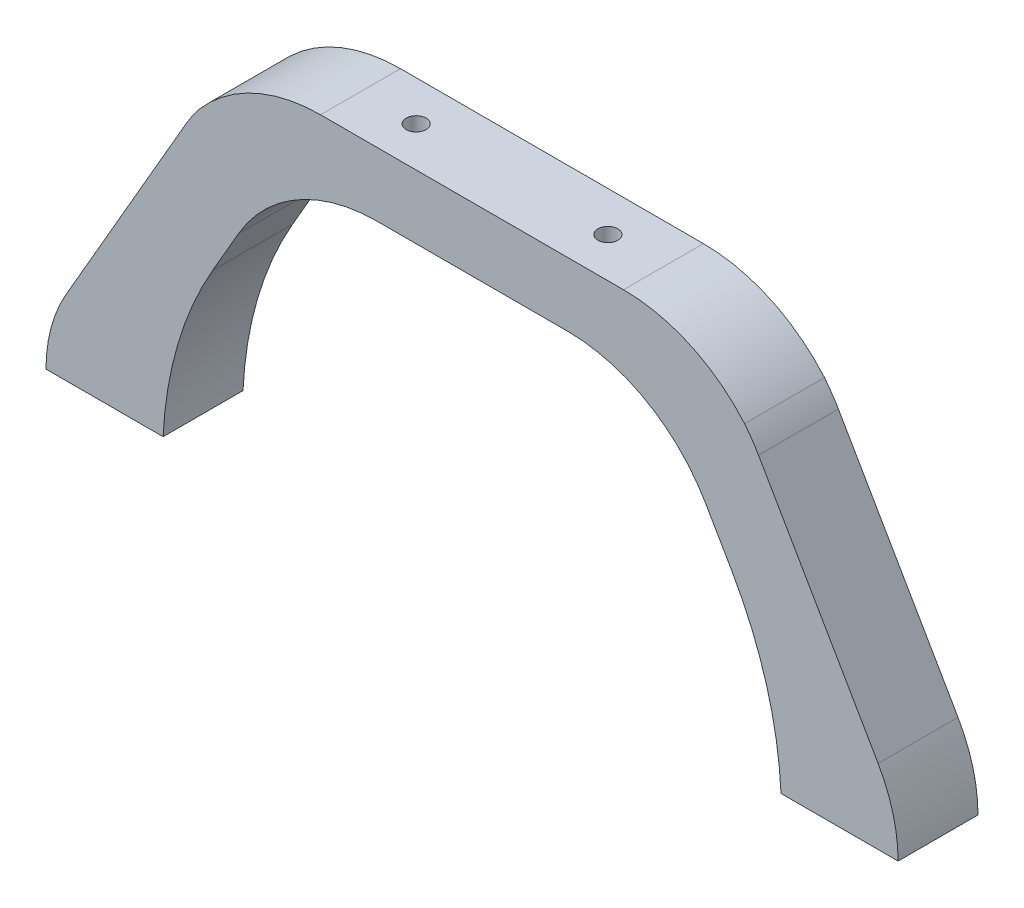
ISO-10303-21;
HEADER;
FILE_DESCRIPTION(('STEP AP214'),'2;1');
FILE_NAME('part.step','',(''),(''),'','','');
FILE_SCHEMA(('AUTOMOTIVE_DESIGN { 1 0 10303 214 1 1 1 1 }'));
ENDSEC;
DATA;
#1=APPLICATION_CONTEXT('core data for automotive mechanical design processes');
#2=APPLICATION_PROTOCOL_DEFINITION('international standard','automotive_design',2000,#1);
#3=PRODUCT_CONTEXT('',#1,'mechanical');
#4=PRODUCT('Part','Part','',(#3));
#5=PRODUCT_RELATED_PRODUCT_CATEGORY('part','',(#4));
#6=PRODUCT_DEFINITION_FORMATION('','',#4);
#7=PRODUCT_DEFINITION_CONTEXT('part definition',#1,'design');
#8=PRODUCT_DEFINITION('design','',#6,#7);
#9=PRODUCT_DEFINITION_SHAPE('','',#8);
#10=(LENGTH_UNIT() NAMED_UNIT(*) SI_UNIT(.MILLI.,.METRE.));
#11=(NAMED_UNIT(*) PLANE_ANGLE_UNIT() SI_UNIT($,.RADIAN.));
#12=(NAMED_UNIT(*) SI_UNIT($,.STERADIAN.) SOLID_ANGLE_UNIT());
#13=UNCERTAINTY_MEASURE_WITH_UNIT(LENGTH_MEASURE(1.E-05),#10,'distance_accuracy_value','');
#14=(GEOMETRIC_REPRESENTATION_CONTEXT(3) GLOBAL_UNCERTAINTY_ASSIGNED_CONTEXT((#13)) GLOBAL_UNIT_ASSIGNED_CONTEXT((#10,
#11,#12)) REPRESENTATION_CONTEXT('',''));
#15=CARTESIAN_POINT('',(0.,0.,0.));
#16=DIRECTION('',(0.,0.,1.));
#17=DIRECTION('',(1.,0.,0.));
#18=AXIS2_PLACEMENT_3D('',#15,#16,#17);
#19=CARTESIAN_POINT('',(18.,49.828096349245,0.));
#20=DIRECTION('',(0.,1.,0.));
#21=DIRECTION('',(0.,0.,1.));
#22=AXIS2_PLACEMENT_3D('',#19,#20,#21);
#23=CYLINDRICAL_SURFACE('',#22,1.875);
#24=CARTESIAN_POINT('',(18.,67.1313972081441,0.));
#25=DIRECTION('',(0.,1.,0.));
#26=DIRECTION('',(0.,0.,1.));
#27=AXIS2_PLACEMENT_3D('',#24,#25,#26);
#28=CIRCLE('',#27,1.875);
#29=CARTESIAN_POINT('',(18.,67.1313972081441,1.875));
#30=VERTEX_POINT('',#29);
#31=EDGE_CURVE('E312',#30,#30,#28,.T.);
#32=ORIENTED_EDGE('',*,*,#31,.T.);
#33=EDGE_LOOP('',(#32));
#34=FACE_BOUND('',#33,.T.);
#35=CARTESIAN_POINT('',(18.,58.1313972081441,0.));
#36=DIRECTION('',(0.,-1.,0.));
#37=DIRECTION('',(0.,0.,-1.));
#38=AXIS2_PLACEMENT_3D('',#35,#36,#37);
#39=CIRCLE('',#38,1.875);
#40=CARTESIAN_POINT('',(18.,58.1313972081441,-1.875));
#41=VERTEX_POINT('',#40);
#42=EDGE_CURVE('E542',#41,#41,#39,.T.);
#43=ORIENTED_EDGE('',*,*,#42,.T.);
#44=EDGE_LOOP('',(#43));
#45=FACE_BOUND('',#44,.T.);
#46=ADVANCED_FACE('F49',(#34,#45),#23,.F.);
#47=CARTESIAN_POINT('',(-18.,49.828096349245,0.));
#48=DIRECTION('',(0.,1.,0.));
#49=DIRECTION('',(0.,0.,1.));
#50=AXIS2_PLACEMENT_3D('',#47,#48,#49);
#51=CYLINDRICAL_SURFACE('',#50,1.875);
#52=CARTESIAN_POINT('',(-18.,67.1313972081441,0.));
#53=DIRECTION('',(0.,1.,0.));
#54=DIRECTION('',(0.,0.,1.));
#55=AXIS2_PLACEMENT_3D('',#52,#53,#54);
#56=CIRCLE('',#55,1.875);
#57=CARTESIAN_POINT('',(-18.,67.1313972081441,1.875));
#58=VERTEX_POINT('',#57);
#59=EDGE_CURVE('E433',#58,#58,#56,.T.);
#60=ORIENTED_EDGE('',*,*,#59,.T.);
#61=EDGE_LOOP('',(#60));
#62=FACE_BOUND('',#61,.T.);
#63=CARTESIAN_POINT('',(-18.,58.1313972081441,0.));
#64=DIRECTION('',(0.,-1.,0.));
#65=DIRECTION('',(0.,0.,-1.));
#66=AXIS2_PLACEMENT_3D('',#63,#64,#65);
#67=CIRCLE('',#66,1.875);
#68=CARTESIAN_POINT('',(-18.,58.1313972081441,-1.875));
#69=VERTEX_POINT('',#68);
#70=EDGE_CURVE('E543',#69,#69,#67,.T.);
#71=ORIENTED_EDGE('',*,*,#70,.T.);
#72=EDGE_LOOP('',(#71));
#73=FACE_BOUND('',#72,.T.);
#74=ADVANCED_FACE('F330',(#62,#73),#51,.F.);
#75=CARTESIAN_POINT('',(0.,0.,7.5));
#76=DIRECTION('',(0.,-1.,0.));
#77=DIRECTION('',(1.,0.,0.));
#78=AXIS2_PLACEMENT_3D('',#75,#76,#77);
#79=PLANE('',#78);
#80=DIRECTION('',(-1.,0.,0.));
#81=VECTOR('',#80,1.);
#82=CARTESIAN_POINT('',(0.,0.,-7.5));
#83=LINE('',#82,#81);
#84=CARTESIAN_POINT('',(-58.0096189432335,0.,-7.5));
#85=VERTEX_POINT('',#84);
#86=CARTESIAN_POINT('',(-80.0000000000001,0.,-7.5));
#87=VERTEX_POINT('',#86);
#88=EDGE_CURVE('E428',#85,#87,#83,.T.);
#89=ORIENTED_EDGE('',*,*,#88,.F.);
#90=DIRECTION('',(0.,0.,-1.));
#91=VECTOR('',#90,1.);
#92=CARTESIAN_POINT('',(-58.0096189432335,0.,7.5));
#93=LINE('',#92,#91);
#94=CARTESIAN_POINT('',(-58.0096189432335,0.,7.5));
#95=VERTEX_POINT('',#94);
#96=EDGE_CURVE('E467',#95,#85,#93,.T.);
#97=ORIENTED_EDGE('',*,*,#96,.F.);
#98=DIRECTION('',(-1.,0.,0.));
#99=VECTOR('',#98,1.);
#100=CARTESIAN_POINT('',(0.,0.,7.5));
#101=LINE('',#100,#99);
#102=CARTESIAN_POINT('',(-80.0000000000001,0.,7.5));
#103=VERTEX_POINT('',#102);
#104=EDGE_CURVE('E409',#95,#103,#101,.T.);
#105=ORIENTED_EDGE('',*,*,#104,.T.);
#106=DIRECTION('',(0.,0.,-1.));
#107=VECTOR('',#106,1.);
#108=CARTESIAN_POINT('',(-80.0000000000001,0.,7.5));
#109=LINE('',#108,#107);
#110=EDGE_CURVE('E471',#103,#87,#109,.T.);
#111=ORIENTED_EDGE('',*,*,#110,.T.);
#112=EDGE_LOOP('',(#89,#97,#105,#111));
#113=FACE_BOUND('',#112,.T.);
#114=ADVANCED_FACE('F333',(#113),#79,.T.);
#115=CARTESIAN_POINT('',(-50.2572142074251,29.0160161513776,7.5));
#116=DIRECTION('',(0.866025403784438,-0.500000000000001,0.));
#117=DIRECTION('',(0.500000000000001,0.866025403784438,0.));
#118=AXIS2_PLACEMENT_3D('',#115,#116,#117);
#119=PLANE('',#118);
#120=DIRECTION('',(-0.500000000000001,-0.866025403784438,0.));
#121=VECTOR('',#120,1.);
#122=CARTESIAN_POINT('',(-50.2572142074251,29.0160161513776,7.5));
#123=LINE('',#122,#121);
#124=CARTESIAN_POINT('',(-43.8397459621556,40.1313972081441,7.5));
#125=VERTEX_POINT('',#124);
#126=CARTESIAN_POINT('',(-48.709369655696,31.6969615571911,7.5));
#127=VERTEX_POINT('',#126);
#128=EDGE_CURVE('E402',#125,#127,#123,.T.);
#129=ORIENTED_EDGE('',*,*,#128,.T.);
#130=DIRECTION('',(0.,0.,-1.));
#131=VECTOR('',#130,1.);
#132=CARTESIAN_POINT('',(-48.709369655696,31.6969615571911,-7.5));
#133=LINE('',#132,#131);
#134=CARTESIAN_POINT('',(-48.709369655696,31.6969615571911,-7.5));
#135=VERTEX_POINT('',#134);
#136=EDGE_CURVE('E212',#127,#135,#133,.T.);
#137=ORIENTED_EDGE('',*,*,#136,.T.);
#138=DIRECTION('',(-0.500000000000001,-0.866025403784438,0.));
#139=VECTOR('',#138,1.);
#140=CARTESIAN_POINT('',(-50.2572142074251,29.0160161513776,-7.5));
#141=LINE('',#140,#139);
#142=CARTESIAN_POINT('',(-43.8397459621556,40.1313972081441,-7.5));
#143=VERTEX_POINT('',#142);
#144=EDGE_CURVE('E432',#143,#135,#141,.T.);
#145=ORIENTED_EDGE('',*,*,#144,.F.);
#146=DIRECTION('',(0.,0.,-1.));
#147=VECTOR('',#146,1.);
#148=CARTESIAN_POINT('',(-43.8397459621556,40.1313972081441,7.5));
#149=LINE('',#148,#147);
#150=EDGE_CURVE('E219',#143,#125,#149,.F.);
#151=ORIENTED_EDGE('',*,*,#150,.T.);
#152=EDGE_LOOP('',(#129,#137,#145,#151));
#153=FACE_BOUND('',#152,.T.);
#154=ADVANCED_FACE('F369',(#153),#119,.T.);
#155=CARTESIAN_POINT('',(0.,55.1313972081441,7.5));
#156=DIRECTION('',(0.,-1.,0.));
#157=DIRECTION('',(0.,0.,-1.));
#158=AXIS2_PLACEMENT_3D('',#155,#156,#157);
#159=PLANE('',#158);
#160=CARTESIAN_POINT('',(18.,55.1313972081441,0.));
#161=DIRECTION('',(0.,-1.,0.));
#162=DIRECTION('',(0.,0.,-1.));
#163=AXIS2_PLACEMENT_3D('',#160,#161,#162);
#164=CIRCLE('',#163,4.);
#165=CARTESIAN_POINT('',(17.8589838486225,55.1313972081441,3.99751353281645));
#166=VERTEX_POINT('',#165);
#167=CARTESIAN_POINT('',(17.8589838486225,55.1313972081441,-3.99751353281645));
#168=VERTEX_POINT('',#167);
#169=EDGE_CURVE('E70',#166,#168,#164,.T.);
#170=ORIENTED_EDGE('',*,*,#169,.F.);
#171=DIRECTION('',(0.,0.,-1.));
#172=VECTOR('',#171,1.);
#173=CARTESIAN_POINT('',(17.8589838486225,55.1313972081441,7.5));
#174=LINE('',#173,#172);
#175=CARTESIAN_POINT('',(17.8589838486225,55.1313972081441,7.5));
#176=VERTEX_POINT('',#175);
#177=EDGE_CURVE('E216',#166,#176,#174,.F.);
#178=ORIENTED_EDGE('',*,*,#177,.T.);
#179=DIRECTION('',(-1.,0.,0.));
#180=VECTOR('',#179,1.);
#181=CARTESIAN_POINT('',(0.,55.1313972081441,7.5));
#182=LINE('',#181,#180);
#183=CARTESIAN_POINT('',(-17.8589838486225,55.1313972081441,7.5));
#184=VERTEX_POINT('',#183);
#185=EDGE_CURVE('E395',#176,#184,#182,.T.);
#186=ORIENTED_EDGE('',*,*,#185,.T.);
#187=DIRECTION('',(0.,0.,-1.));
#188=VECTOR('',#187,1.);
#189=CARTESIAN_POINT('',(-17.8589838486225,55.1313972081441,-7.5));
#190=LINE('',#189,#188);
#191=CARTESIAN_POINT('',(-17.8589838486225,55.1313972081441,4.37272677457107));
#192=VERTEX_POINT('',#191);
#193=EDGE_CURVE('E203',#184,#192,#190,.T.);
#194=ORIENTED_EDGE('',*,*,#193,.T.);
#195=CARTESIAN_POINT('',(-18.,55.1313972081441,0.));
#196=DIRECTION('',(0.,-1.,0.));
#197=DIRECTION('',(0.,0.,-1.));
#198=AXIS2_PLACEMENT_3D('',#195,#196,#197);
#199=CIRCLE('',#198,4.375);
#200=CARTESIAN_POINT('',(-17.8589838486225,55.1313972081441,-4.37272677457107));
#201=VERTEX_POINT('',#200);
#202=EDGE_CURVE('E76',#201,#192,#199,.T.);
#203=ORIENTED_EDGE('',*,*,#202,.F.);
#204=DIRECTION('',(0.,0.,-1.));
#205=VECTOR('',#204,1.);
#206=CARTESIAN_POINT('',(-17.8589838486225,55.1313972081441,-7.5));
#207=LINE('',#206,#205);
#208=CARTESIAN_POINT('',(-17.8589838486225,55.1313972081441,-7.5));
#209=VERTEX_POINT('',#208);
#210=EDGE_CURVE('E200',#201,#209,#207,.T.);
#211=ORIENTED_EDGE('',*,*,#210,.T.);
#212=DIRECTION('',(-1.,0.,0.));
#213=VECTOR('',#212,1.);
#214=CARTESIAN_POINT('',(0.,55.1313972081441,-7.5));
#215=LINE('',#214,#213);
#216=CARTESIAN_POINT('',(17.8589838486225,55.1313972081441,-7.5));
#217=VERTEX_POINT('',#216);
#218=EDGE_CURVE('E437',#217,#209,#215,.T.);
#219=ORIENTED_EDGE('',*,*,#218,.F.);
#220=DIRECTION('',(0.,0.,-1.));
#221=VECTOR('',#220,1.);
#222=CARTESIAN_POINT('',(17.8589838486225,55.1313972081441,7.5));
#223=LINE('',#222,#221);
#224=EDGE_CURVE('E225',#217,#168,#223,.F.);
#225=ORIENTED_EDGE('',*,*,#224,.T.);
#226=EDGE_LOOP('',(#170,#178,#186,#194,#203,#211,#219,#225));
#227=FACE_BOUND('',#226,.T.);
#228=ADVANCED_FACE('F198',(#227),#159,.T.);
#229=CARTESIAN_POINT('',(50.2572142074251,29.0160161513776,7.5));
#230=DIRECTION('',(0.866025403784438,0.500000000000001,0.));
#231=DIRECTION('',(-0.500000000000001,0.866025403784438,0.));
#232=AXIS2_PLACEMENT_3D('',#229,#230,#231);
#233=PLANE('',#232);
#234=DIRECTION('',(0.500000000000001,-0.866025403784438,0.));
#235=VECTOR('',#234,1.);
#236=CARTESIAN_POINT('',(50.2572142074251,29.0160161513776,-7.5));
#237=LINE('',#236,#235);
#238=CARTESIAN_POINT('',(43.8397459621556,40.1313972081441,-7.5));
#239=VERTEX_POINT('',#238);
#240=CARTESIAN_POINT('',(48.709369655696,31.6969615571911,-7.5));
#241=VERTEX_POINT('',#240);
#242=EDGE_CURVE('E440',#239,#241,#237,.T.);
#243=ORIENTED_EDGE('',*,*,#242,.T.);
#244=DIRECTION('',(0.,0.,-1.));
#245=VECTOR('',#244,1.);
#246=CARTESIAN_POINT('',(48.709369655696,31.6969615571911,7.5));
#247=LINE('',#246,#245);
#248=CARTESIAN_POINT('',(48.709369655696,31.6969615571911,7.5));
#249=VERTEX_POINT('',#248);
#250=EDGE_CURVE('E479',#241,#249,#247,.F.);
#251=ORIENTED_EDGE('',*,*,#250,.T.);
#252=DIRECTION('',(0.500000000000001,-0.866025403784438,0.));
#253=VECTOR('',#252,1.);
#254=CARTESIAN_POINT('',(50.2572142074251,29.0160161513776,7.5));
#255=LINE('',#254,#253);
#256=CARTESIAN_POINT('',(43.8397459621556,40.1313972081441,7.5));
#257=VERTEX_POINT('',#256);
#258=EDGE_CURVE('E401',#257,#249,#255,.T.);
#259=ORIENTED_EDGE('',*,*,#258,.F.);
#260=DIRECTION('',(0.,0.,-1.));
#261=VECTOR('',#260,1.);
#262=CARTESIAN_POINT('',(43.8397459621556,40.1313972081441,7.5));
#263=LINE('',#262,#261);
#264=EDGE_CURVE('E475',#257,#239,#263,.T.);
#265=ORIENTED_EDGE('',*,*,#264,.T.);
#266=EDGE_LOOP('',(#243,#251,#259,#265));
#267=FACE_BOUND('',#266,.T.);
#268=ADVANCED_FACE('F362',(#267),#233,.F.);
#269=CARTESIAN_POINT('',(0.,0.,7.5));
#270=DIRECTION('',(0.,1.,0.));
#271=DIRECTION('',(-1.,0.,0.));
#272=AXIS2_PLACEMENT_3D('',#269,#270,#271);
#273=PLANE('',#272);
#274=DIRECTION('',(1.,0.,0.));
#275=VECTOR('',#274,1.);
#276=CARTESIAN_POINT('',(0.,0.,-7.5));
#277=LINE('',#276,#275);
#278=CARTESIAN_POINT('',(58.0096189432335,0.,-7.5));
#279=VERTEX_POINT('',#278);
#280=CARTESIAN_POINT('',(80.0000000000001,0.,-7.5));
#281=VERTEX_POINT('',#280);
#282=EDGE_CURVE('E444',#279,#281,#277,.T.);
#283=ORIENTED_EDGE('',*,*,#282,.T.);
#284=DIRECTION('',(0.,0.,-1.));
#285=VECTOR('',#284,1.);
#286=CARTESIAN_POINT('',(80.0000000000001,0.,7.5));
#287=LINE('',#286,#285);
#288=CARTESIAN_POINT('',(80.0000000000001,0.,7.5));
#289=VERTEX_POINT('',#288);
#290=EDGE_CURVE('E427',#289,#281,#287,.T.);
#291=ORIENTED_EDGE('',*,*,#290,.F.);
#292=DIRECTION('',(1.,0.,0.));
#293=VECTOR('',#292,1.);
#294=CARTESIAN_POINT('',(0.,0.,7.5));
#295=LINE('',#294,#293);
#296=CARTESIAN_POINT('',(58.0096189432335,0.,7.5));
#297=VERTEX_POINT('',#296);
#298=EDGE_CURVE('E406',#297,#289,#295,.T.);
#299=ORIENTED_EDGE('',*,*,#298,.F.);
#300=DIRECTION('',(0.,0.,-1.));
#301=VECTOR('',#300,1.);
#302=CARTESIAN_POINT('',(58.0096189432335,0.,7.5));
#303=LINE('',#302,#301);
#304=EDGE_CURVE('E463',#297,#279,#303,.T.);
#305=ORIENTED_EDGE('',*,*,#304,.T.);
#306=EDGE_LOOP('',(#283,#291,#299,#305));
#307=FACE_BOUND('',#306,.T.);
#308=ADVANCED_FACE('F358',(#307),#273,.F.);
#309=CARTESIAN_POINT('',(63.2475952641916,36.5160161513776,7.5));
#310=DIRECTION('',(-0.866025403784438,-0.500000000000001,0.));
#311=DIRECTION('',(0.500000000000001,-0.866025403784438,0.));
#312=AXIS2_PLACEMENT_3D('',#309,#310,#311);
#313=PLANE('',#312);
#314=DIRECTION('',(-0.500000000000001,0.866025403784438,0.));
#315=VECTOR('',#314,1.);
#316=CARTESIAN_POINT('',(63.2475952641916,36.5160161513776,7.5));
#317=LINE('',#316,#315);
#318=CARTESIAN_POINT('',(76.248711424607,13.9974224064335,7.5));
#319=VERTEX_POINT('',#318);
#320=CARTESIAN_POINT('',(53.7866882437943,52.9027877963907,7.5));
#321=VERTEX_POINT('',#320);
#322=EDGE_CURVE('E415',#319,#321,#317,.T.);
#323=ORIENTED_EDGE('',*,*,#322,.F.);
#324=DIRECTION('',(0.,0.,-1.));
#325=VECTOR('',#324,1.);
#326=CARTESIAN_POINT('',(76.248711424607,13.9974224064335,7.5));
#327=LINE('',#326,#325);
#328=CARTESIAN_POINT('',(76.248711424607,13.9974224064335,-7.5));
#329=VERTEX_POINT('',#328);
#330=EDGE_CURVE('E256',#319,#329,#327,.T.);
#331=ORIENTED_EDGE('',*,*,#330,.T.);
#332=DIRECTION('',(-0.500000000000001,0.866025403784438,0.));
#333=VECTOR('',#332,1.);
#334=CARTESIAN_POINT('',(63.2475952641916,36.5160161513776,-7.5));
#335=LINE('',#334,#333);
#336=CARTESIAN_POINT('',(53.7866882437943,52.9027877963907,-7.5));
#337=VERTEX_POINT('',#336);
#338=EDGE_CURVE('E448',#329,#337,#335,.T.);
#339=ORIENTED_EDGE('',*,*,#338,.T.);
#340=DIRECTION('',(0.,0.,-1.));
#341=VECTOR('',#340,1.);
#342=CARTESIAN_POINT('',(53.7866882437943,52.9027877963907,7.5));
#343=LINE('',#342,#341);
#344=EDGE_CURVE('E252',#337,#321,#343,.F.);
#345=ORIENTED_EDGE('',*,*,#344,.T.);
#346=EDGE_LOOP('',(#323,#331,#339,#345));
#347=FACE_BOUND('',#346,.T.);
#348=ADVANCED_FACE('F354',(#347),#313,.F.);
#349=CARTESIAN_POINT('',(0.,67.1313972081441,7.5));
#350=DIRECTION('',(0.,1.,0.));
#351=DIRECTION('',(0.,0.,1.));
#352=AXIS2_PLACEMENT_3D('',#349,#350,#351);
#353=PLANE('',#352);
#354=ORIENTED_EDGE('',*,*,#59,.F.);
#355=EDGE_LOOP('',(#354));
#356=FACE_BOUND('',#355,.T.);
#357=ORIENTED_EDGE('',*,*,#31,.F.);
#358=EDGE_LOOP('',(#357));
#359=FACE_BOUND('',#358,.T.);
#360=DIRECTION('',(1.,0.,0.));
#361=VECTOR('',#360,1.);
#362=CARTESIAN_POINT('',(0.,67.1313972081441,7.5));
#363=LINE('',#362,#361);
#364=CARTESIAN_POINT('',(-28.4487516204667,67.1313972081441,7.5));
#365=VERTEX_POINT('',#364);
#366=CARTESIAN_POINT('',(28.4487516204667,67.1313972081441,7.5));
#367=VERTEX_POINT('',#366);
#368=EDGE_CURVE('E419',#365,#367,#363,.T.);
#369=ORIENTED_EDGE('',*,*,#368,.T.);
#370=DIRECTION('',(0.,0.,-1.));
#371=VECTOR('',#370,1.);
#372=CARTESIAN_POINT('',(28.4487516204667,67.1313972081441,7.5));
#373=LINE('',#372,#371);
#374=CARTESIAN_POINT('',(28.4487516204667,67.1313972081441,-7.5));
#375=VERTEX_POINT('',#374);
#376=EDGE_CURVE('E196',#367,#375,#373,.T.);
#377=ORIENTED_EDGE('',*,*,#376,.T.);
#378=DIRECTION('',(1.,0.,0.));
#379=VECTOR('',#378,1.);
#380=CARTESIAN_POINT('',(0.,67.1313972081441,-7.5));
#381=LINE('',#380,#379);
#382=CARTESIAN_POINT('',(-28.4487516204667,67.1313972081441,-7.5));
#383=VERTEX_POINT('',#382);
#384=EDGE_CURVE('E452',#383,#375,#381,.T.);
#385=ORIENTED_EDGE('',*,*,#384,.F.);
#386=DIRECTION('',(0.,0.,-1.));
#387=VECTOR('',#386,1.);
#388=CARTESIAN_POINT('',(-28.4487516204667,67.1313972081441,7.5));
#389=LINE('',#388,#387);
#390=EDGE_CURVE('E303',#383,#365,#389,.F.);
#391=ORIENTED_EDGE('',*,*,#390,.T.);
#392=EDGE_LOOP('',(#369,#377,#385,#391));
#393=FACE_BOUND('',#392,.T.);
#394=ADVANCED_FACE('F350',(#356,#359,#393),#353,.T.);
#395=CARTESIAN_POINT('',(-63.2475952641916,36.5160161513776,7.5));
#396=DIRECTION('',(-0.866025403784438,0.500000000000001,0.));
#397=DIRECTION('',(-0.500000000000001,-0.866025403784438,0.));
#398=AXIS2_PLACEMENT_3D('',#395,#396,#397);
#399=PLANE('',#398);
#400=DIRECTION('',(0.500000000000001,0.866025403784438,0.));
#401=VECTOR('',#400,1.);
#402=CARTESIAN_POINT('',(-63.2475952641916,36.5160161513776,-7.5));
#403=LINE('',#402,#401);
#404=CARTESIAN_POINT('',(-76.248711424607,13.9974224064335,-7.5));
#405=VERTEX_POINT('',#404);
#406=CARTESIAN_POINT('',(-53.7866882437943,52.9027877963908,-7.5));
#407=VERTEX_POINT('',#406);
#408=EDGE_CURVE('E456',#405,#407,#403,.T.);
#409=ORIENTED_EDGE('',*,*,#408,.F.);
#410=DIRECTION('',(0.,0.,-1.));
#411=VECTOR('',#410,1.);
#412=CARTESIAN_POINT('',(-76.248711424607,13.9974224064335,7.5));
#413=LINE('',#412,#411);
#414=CARTESIAN_POINT('',(-76.248711424607,13.9974224064335,7.5));
#415=VERTEX_POINT('',#414);
#416=EDGE_CURVE('E300',#405,#415,#413,.F.);
#417=ORIENTED_EDGE('',*,*,#416,.T.);
#418=DIRECTION('',(0.500000000000001,0.866025403784438,0.));
#419=VECTOR('',#418,1.);
#420=CARTESIAN_POINT('',(-63.2475952641916,36.5160161513776,7.5));
#421=LINE('',#420,#419);
#422=CARTESIAN_POINT('',(-53.7866882437943,52.9027877963908,7.5));
#423=VERTEX_POINT('',#422);
#424=EDGE_CURVE('E423',#415,#423,#421,.T.);
#425=ORIENTED_EDGE('',*,*,#424,.T.);
#426=DIRECTION('',(0.,0.,-1.));
#427=VECTOR('',#426,1.);
#428=CARTESIAN_POINT('',(-53.7866882437943,52.9027877963908,7.5));
#429=LINE('',#428,#427);
#430=EDGE_CURVE('E296',#423,#407,#429,.T.);
#431=ORIENTED_EDGE('',*,*,#430,.T.);
#432=EDGE_LOOP('',(#409,#417,#425,#431));
#433=FACE_BOUND('',#432,.T.);
#434=ADVANCED_FACE('F342',(#433),#399,.T.);
#435=CARTESIAN_POINT('',(0.,0.,7.5));
#436=DIRECTION('',(0.,0.,1.));
#437=DIRECTION('',(1.,0.,0.));
#438=AXIS2_PLACEMENT_3D('',#435,#436,#437);
#439=PLANE('',#438);
#440=ORIENTED_EDGE('',*,*,#298,.T.);
#441=CARTESIAN_POINT('',(52.0000001186427,-0.00257759356654154,7.5));
#442=DIRECTION('',(0.,0.,1.));
#443=DIRECTION('',(1.,0.,0.));
#444=AXIS2_PLACEMENT_3D('',#441,#442,#443);
#445=CIRCLE('',#444,28.);
#446=EDGE_CURVE('E293',#289,#319,#445,.T.);
#447=ORIENTED_EDGE('',*,*,#446,.T.);
#448=ORIENTED_EDGE('',*,*,#322,.T.);
#449=CARTESIAN_POINT('',(27.8059261302612,37.9027877963907,7.5));
#450=DIRECTION('',(0.,0.,1.));
#451=DIRECTION('',(1.,0.,0.));
#452=AXIS2_PLACEMENT_3D('',#449,#450,#451);
#453=CIRCLE('',#452,30.);
#454=CARTESIAN_POINT('',(51.1707496498934,56.7199348143752,7.5));
#455=VERTEX_POINT('',#454);
#456=EDGE_CURVE('E287',#321,#455,#453,.T.);
#457=ORIENTED_EDGE('',*,*,#456,.T.);
#458=CARTESIAN_POINT('',(28.4487516204667,37.1313972081441,7.5));
#459=DIRECTION('',(0.,0.,1.));
#460=DIRECTION('',(1.,0.,0.));
#461=AXIS2_PLACEMENT_3D('',#458,#459,#460);
#462=CIRCLE('',#461,30.);
#463=EDGE_CURVE('E284',#455,#367,#462,.T.);
#464=ORIENTED_EDGE('',*,*,#463,.T.);
#465=ORIENTED_EDGE('',*,*,#368,.F.);
#466=CARTESIAN_POINT('',(-28.4487516204667,37.1313972081441,7.5));
#467=DIRECTION('',(0.,0.,1.));
#468=DIRECTION('',(1.,0.,0.));
#469=AXIS2_PLACEMENT_3D('',#466,#467,#468);
#470=CIRCLE('',#469,30.);
#471=CARTESIAN_POINT('',(-51.1707496498934,56.7199348143753,7.5));
#472=VERTEX_POINT('',#471);
#473=EDGE_CURVE('E278',#365,#472,#470,.T.);
#474=ORIENTED_EDGE('',*,*,#473,.T.);
#475=CARTESIAN_POINT('',(-27.8059261302612,37.9027877963908,7.5));
#476=DIRECTION('',(0.,0.,1.));
#477=DIRECTION('',(1.,0.,0.));
#478=AXIS2_PLACEMENT_3D('',#475,#476,#477);
#479=CIRCLE('',#478,30.);
#480=EDGE_CURVE('E281',#472,#423,#479,.T.);
#481=ORIENTED_EDGE('',*,*,#480,.T.);
#482=ORIENTED_EDGE('',*,*,#424,.F.);
#483=CARTESIAN_POINT('',(-52.0000001186427,-0.00257759356654154,7.5));
#484=DIRECTION('',(0.,0.,1.));
#485=DIRECTION('',(1.,0.,0.));
#486=AXIS2_PLACEMENT_3D('',#483,#484,#485);
#487=CIRCLE('',#486,28.);
#488=EDGE_CURVE('E290',#415,#103,#487,.T.);
#489=ORIENTED_EDGE('',*,*,#488,.T.);
#490=ORIENTED_EDGE('',*,*,#104,.F.);
#491=CARTESIAN_POINT('',(11.9124086092147,-3.30303844280901,7.5));
#492=DIRECTION('',(0.,0.,1.));
#493=DIRECTION('',(1.,0.,0.));
#494=AXIS2_PLACEMENT_3D('',#491,#492,#493);
#495=CIRCLE('',#494,70.);
#496=EDGE_CURVE('E238',#95,#127,#495,.F.);
#497=ORIENTED_EDGE('',*,*,#496,.T.);
#498=ORIENTED_EDGE('',*,*,#128,.F.);
#499=CARTESIAN_POINT('',(-17.8589838486225,25.1313972081441,7.5));
#500=DIRECTION('',(0.,0.,1.));
#501=DIRECTION('',(1.,0.,0.));
#502=AXIS2_PLACEMENT_3D('',#499,#500,#501);
#503=CIRCLE('',#502,30.);
#504=EDGE_CURVE('E249',#125,#184,#503,.F.);
#505=ORIENTED_EDGE('',*,*,#504,.T.);
#506=ORIENTED_EDGE('',*,*,#185,.F.);
#507=CARTESIAN_POINT('',(17.8589838486225,25.1313972081441,7.5));
#508=DIRECTION('',(0.,0.,1.));
#509=DIRECTION('',(1.,0.,0.));
#510=AXIS2_PLACEMENT_3D('',#507,#508,#509);
#511=CIRCLE('',#510,30.);
#512=EDGE_CURVE('E244',#176,#257,#511,.F.);
#513=ORIENTED_EDGE('',*,*,#512,.T.);
#514=ORIENTED_EDGE('',*,*,#258,.T.);
#515=CARTESIAN_POINT('',(-11.9124086092147,-3.30303844280901,7.5));
#516=DIRECTION('',(0.,0.,1.));
#517=DIRECTION('',(1.,0.,0.));
#518=AXIS2_PLACEMENT_3D('',#515,#516,#517);
#519=CIRCLE('',#518,70.);
#520=EDGE_CURVE('E232',#249,#297,#519,.F.);
#521=ORIENTED_EDGE('',*,*,#520,.T.);
#522=EDGE_LOOP('',(#440,#447,#448,#457,#464,#465,#474,#481,#482,#489,#490,#497,#498,#505,#506,
#513,#514,#521));
#523=FACE_BOUND('',#522,.T.);
#524=ADVANCED_FACE('F338',(#523),#439,.T.);
#525=CARTESIAN_POINT('',(0.,0.,-7.5));
#526=DIRECTION('',(0.,0.,1.));
#527=DIRECTION('',(1.,0.,0.));
#528=AXIS2_PLACEMENT_3D('',#525,#526,#527);
#529=PLANE('',#528);
#530=ORIENTED_EDGE('',*,*,#338,.F.);
#531=CARTESIAN_POINT('',(52.0000001186427,-0.00257759356654154,-7.5));
#532=DIRECTION('',(0.,0.,1.));
#533=DIRECTION('',(1.,0.,0.));
#534=AXIS2_PLACEMENT_3D('',#531,#532,#533);
#535=CIRCLE('',#534,28.);
#536=EDGE_CURVE('E275',#329,#281,#535,.F.);
#537=ORIENTED_EDGE('',*,*,#536,.T.);
#538=ORIENTED_EDGE('',*,*,#282,.F.);
#539=CARTESIAN_POINT('',(-11.9124086092147,-3.30303844280901,-7.5));
#540=DIRECTION('',(0.,0.,1.));
#541=DIRECTION('',(1.,0.,0.));
#542=AXIS2_PLACEMENT_3D('',#539,#540,#541);
#543=CIRCLE('',#542,70.);
#544=EDGE_CURVE('E229',#279,#241,#543,.T.);
#545=ORIENTED_EDGE('',*,*,#544,.T.);
#546=ORIENTED_EDGE('',*,*,#242,.F.);
#547=CARTESIAN_POINT('',(17.8589838486225,25.1313972081441,-7.5));
#548=DIRECTION('',(0.,0.,1.));
#549=DIRECTION('',(1.,0.,0.));
#550=AXIS2_PLACEMENT_3D('',#547,#548,#549);
#551=CIRCLE('',#550,30.);
#552=EDGE_CURVE('E241',#239,#217,#551,.T.);
#553=ORIENTED_EDGE('',*,*,#552,.T.);
#554=ORIENTED_EDGE('',*,*,#218,.T.);
#555=CARTESIAN_POINT('',(-17.8589838486225,25.1313972081441,-7.5));
#556=DIRECTION('',(0.,0.,1.));
#557=DIRECTION('',(1.,0.,0.));
#558=AXIS2_PLACEMENT_3D('',#555,#556,#557);
#559=CIRCLE('',#558,30.);
#560=EDGE_CURVE('E210',#209,#143,#559,.T.);
#561=ORIENTED_EDGE('',*,*,#560,.T.);
#562=ORIENTED_EDGE('',*,*,#144,.T.);
#563=CARTESIAN_POINT('',(11.9124086092147,-3.30303844280901,-7.5));
#564=DIRECTION('',(0.,0.,1.));
#565=DIRECTION('',(1.,0.,0.));
#566=AXIS2_PLACEMENT_3D('',#563,#564,#565);
#567=CIRCLE('',#566,70.);
#568=EDGE_CURVE('E235',#135,#85,#567,.T.);
#569=ORIENTED_EDGE('',*,*,#568,.T.);
#570=ORIENTED_EDGE('',*,*,#88,.T.);
#571=CARTESIAN_POINT('',(-52.0000001186427,-0.00257759356654154,-7.5));
#572=DIRECTION('',(0.,0.,1.));
#573=DIRECTION('',(1.,0.,0.));
#574=AXIS2_PLACEMENT_3D('',#571,#572,#573);
#575=CIRCLE('',#574,28.);
#576=EDGE_CURVE('E272',#87,#405,#575,.F.);
#577=ORIENTED_EDGE('',*,*,#576,.T.);
#578=ORIENTED_EDGE('',*,*,#408,.T.);
#579=CARTESIAN_POINT('',(-27.8059261302612,37.9027877963908,-7.5));
#580=DIRECTION('',(0.,0.,1.));
#581=DIRECTION('',(1.,0.,0.));
#582=AXIS2_PLACEMENT_3D('',#579,#580,#581);
#583=CIRCLE('',#582,30.);
#584=CARTESIAN_POINT('',(-51.1707496498934,56.7199348143753,-7.5));
#585=VERTEX_POINT('',#584);
#586=EDGE_CURVE('E263',#407,#585,#583,.F.);
#587=ORIENTED_EDGE('',*,*,#586,.T.);
#588=CARTESIAN_POINT('',(-28.4487516204667,37.1313972081441,-7.5));
#589=DIRECTION('',(0.,0.,1.));
#590=DIRECTION('',(1.,0.,0.));
#591=AXIS2_PLACEMENT_3D('',#588,#589,#590);
#592=CIRCLE('',#591,30.);
#593=EDGE_CURVE('E260',#585,#383,#592,.F.);
#594=ORIENTED_EDGE('',*,*,#593,.T.);
#595=ORIENTED_EDGE('',*,*,#384,.T.);
#596=CARTESIAN_POINT('',(28.4487516204667,37.1313972081441,-7.5));
#597=DIRECTION('',(0.,0.,1.));
#598=DIRECTION('',(1.,0.,0.));
#599=AXIS2_PLACEMENT_3D('',#596,#597,#598);
#600=CIRCLE('',#599,30.);
#601=CARTESIAN_POINT('',(51.1707496498934,56.7199348143752,-7.5));
#602=VERTEX_POINT('',#601);
#603=EDGE_CURVE('E266',#375,#602,#600,.F.);
#604=ORIENTED_EDGE('',*,*,#603,.T.);
#605=CARTESIAN_POINT('',(27.8059261302612,37.9027877963907,-7.5));
#606=DIRECTION('',(0.,0.,1.));
#607=DIRECTION('',(1.,0.,0.));
#608=AXIS2_PLACEMENT_3D('',#605,#606,#607);
#609=CIRCLE('',#608,30.);
#610=EDGE_CURVE('E269',#602,#337,#609,.F.);
#611=ORIENTED_EDGE('',*,*,#610,.T.);
#612=EDGE_LOOP('',(#530,#537,#538,#545,#546,#553,#554,#561,#562,#569,#570,#577,#578,#587,#594,
#595,#604,#611));
#613=FACE_BOUND('',#612,.T.);
#614=ADVANCED_FACE('F341',(#613),#529,.F.);
#615=CARTESIAN_POINT('',(-11.9124086092147,-3.30303844280901,7.5));
#616=DIRECTION('',(0.,0.,-1.));
#617=DIRECTION('',(-1.,0.,0.));
#618=AXIS2_PLACEMENT_3D('',#615,#616,#617);
#619=CYLINDRICAL_SURFACE('',#618,70.);
#620=ORIENTED_EDGE('',*,*,#520,.F.);
#621=ORIENTED_EDGE('',*,*,#250,.F.);
#622=ORIENTED_EDGE('',*,*,#544,.F.);
#623=ORIENTED_EDGE('',*,*,#304,.F.);
#624=EDGE_LOOP('',(#620,#621,#622,#623));
#625=FACE_BOUND('',#624,.T.);
#626=ADVANCED_FACE('F346',(#625),#619,.F.);
#627=CARTESIAN_POINT('',(11.9124086092147,-3.30303844280901,7.5));
#628=DIRECTION('',(0.,0.,1.));
#629=DIRECTION('',(1.,0.,0.));
#630=AXIS2_PLACEMENT_3D('',#627,#628,#629);
#631=CYLINDRICAL_SURFACE('',#630,70.);
#632=ORIENTED_EDGE('',*,*,#496,.F.);
#633=ORIENTED_EDGE('',*,*,#96,.T.);
#634=ORIENTED_EDGE('',*,*,#568,.F.);
#635=ORIENTED_EDGE('',*,*,#136,.F.);
#636=EDGE_LOOP('',(#632,#633,#634,#635));
#637=FACE_BOUND('',#636,.T.);
#638=ADVANCED_FACE('F378',(#637),#631,.F.);
#639=CARTESIAN_POINT('',(17.8589838486225,25.1313972081441,7.5));
#640=DIRECTION('',(0.,0.,-1.));
#641=DIRECTION('',(-1.,0.,0.));
#642=AXIS2_PLACEMENT_3D('',#639,#640,#641);
#643=CYLINDRICAL_SURFACE('',#642,30.);
#644=ORIENTED_EDGE('',*,*,#177,.F.);
#645=CARTESIAN_POINT('',(17.8589838486225,55.1313972081441,3.99751353281645));
#646=CARTESIAN_POINT('',(17.970858212867,55.1314033062688,4.0014713752476));
#647=CARTESIAN_POINT('',(18.0828934106365,55.1307715485684,4.00070999036708));
#648=CARTESIAN_POINT('',(18.3064841959427,55.1282661563517,3.98980845859091));
#649=CARTESIAN_POINT('',(18.4180398202299,55.1263926187659,3.97966904369982));
#650=CARTESIAN_POINT('',(18.6397693316045,55.1214401401511,3.95008756119516));
#651=CARTESIAN_POINT('',(18.749944568108,55.1183624896496,3.93065544824118));
#652=CARTESIAN_POINT('',(18.9682183119689,55.1110828188676,3.88266115338927));
#653=CARTESIAN_POINT('',(19.076316831859,55.1068808053748,3.85409902660861));
#654=CARTESIAN_POINT('',(19.396425584481,55.0927337365646,3.75496811673843));
#655=CARTESIAN_POINT('',(19.6043760073811,55.0812446453841,3.67093772373856));
#656=CARTESIAN_POINT('',(20.0030780742063,55.0553495155383,3.46952970072038));
#657=CARTESIAN_POINT('',(20.1938308325274,55.0409436660734,3.35215423348737));
#658=CARTESIAN_POINT('',(20.5540674810228,55.0106440071921,3.08659275264221));
#659=CARTESIAN_POINT('',(20.7234286480134,54.9947424512444,2.9382408643046));
#660=CARTESIAN_POINT('',(21.0349480898635,54.9632231152026,2.61523528584389));
#661=CARTESIAN_POINT('',(21.1771019661499,54.9476053813625,2.44057735099312));
#662=CARTESIAN_POINT('',(21.4307915808714,54.9182839428825,2.06893968071245));
#663=CARTESIAN_POINT('',(21.5421836761946,54.904589359823,1.87186109592611));
#664=CARTESIAN_POINT('',(21.7302360503149,54.8807239431564,1.46159226697065));
#665=CARTESIAN_POINT('',(21.806899814014,54.8705527560093,1.2484036419104));
#666=CARTESIAN_POINT('',(21.9228909287332,54.8549248426531,0.813230839042929));
#667=CARTESIAN_POINT('',(21.9624279687981,54.8494416549033,0.5913035261243));
#668=CARTESIAN_POINT('',(22.0037181787843,54.8437116056915,0.143894104186043));
#669=CARTESIAN_POINT('',(22.0054723907205,54.8434645998205,-0.0815879066267352));
#670=CARTESIAN_POINT('',(21.9712772849023,54.8482160628702,-0.527893370210359));
#671=CARTESIAN_POINT('',(21.9356128740835,54.8531748944995,-0.748739153527088));
#672=CARTESIAN_POINT('',(21.8280889144254,54.8677237886603,-1.18126979441376));
#673=CARTESIAN_POINT('',(21.7562293068246,54.8773138587104,-1.39295463711066));
#674=CARTESIAN_POINT('',(21.578217653038,54.9000942544072,-1.80171092317063));
#675=CARTESIAN_POINT('',(21.4719912007612,54.9132923819964,-1.99874950784758));
#676=CARTESIAN_POINT('',(21.2283072739703,54.9418426240993,-2.37229159812301));
#677=CARTESIAN_POINT('',(21.0908480238807,54.9571948610545,-2.54879393537882));
#678=CARTESIAN_POINT('',(20.7872162991079,54.9885385771919,-2.87784069546688));
#679=CARTESIAN_POINT('',(20.6208095527508,55.0045343827512,-3.03016857992326));
#680=CARTESIAN_POINT('',(20.2646919665131,55.0353174567777,-3.30480378809725));
#681=CARTESIAN_POINT('',(20.0749781198282,55.0501045689032,-3.42710723230449));
#682=CARTESIAN_POINT('',(19.6771001922327,55.0769191640921,-3.63843653558137));
#683=CARTESIAN_POINT('',(19.468893452176,55.0889400241485,-3.72738284425502));
#684=CARTESIAN_POINT('',(19.0403632196279,55.1088917760794,-3.86890777120165));
#685=CARTESIAN_POINT('',(18.8200503759577,55.1168262007101,-3.92151781593401));
#686=CARTESIAN_POINT('',(18.4749031612858,55.125324245494,-3.9736343502178));
#687=CARTESIAN_POINT('',(18.3519703475622,55.1275985227176,-3.98639770572749));
#688=CARTESIAN_POINT('',(18.1056384970348,55.1306368102676,-4.00050370869691));
#689=CARTESIAN_POINT('',(17.9822405793108,55.1314033323509,-4.00186536250559));
#690=CARTESIAN_POINT('',(17.8589838486225,55.1313972081441,-3.99751353281645));
#691=B_SPLINE_CURVE_WITH_KNOTS('',3,(#645,#646,#647,#648,#649,#650,#651,#652,#653,#654,#655,
#656,#657,#658,#659,#660,#661,#662,#663,#664,#665,#666,#667,#668,#669,#670,#671,#672,#673,#674,
#675,#676,#677,#678,#679,#680,#681,#682,#683,#684,#685,#686,#687,#688,#689,#690),.UNSPECIFIED.,
.F.,.F.,(4,2,2,2,2,2,2,2,2,2,2,2,2,2,2,2,2,2,2,2,2,2,4),(0.,0.335722142817424,0.671418082966749,
1.00675521683063,1.34209032632518,2.0123808599314,2.68262792793762,3.35656061299934,
4.03060216016417,4.70773990059048,5.38480967686082,6.05803199643173,6.73123574914188,
7.39935064412557,8.0674666237711,8.73703890121065,9.40664925317005,10.0819548650215,
10.7573476884176,11.4343411040954,12.110748266931,12.4811128658019,12.8508599530704),.UNSPECIFIED.);
#692=EDGE_CURVE('E12',#166,#168,#691,.T.);
#693=ORIENTED_EDGE('',*,*,#692,.T.);
#694=ORIENTED_EDGE('',*,*,#224,.F.);
#695=ORIENTED_EDGE('',*,*,#552,.F.);
#696=ORIENTED_EDGE('',*,*,#264,.F.);
#697=ORIENTED_EDGE('',*,*,#512,.F.);
#698=EDGE_LOOP('',(#644,#693,#694,#695,#696,#697));
#699=FACE_BOUND('',#698,.T.);
#700=ADVANCED_FACE('F381',(#699),#643,.F.);
#701=CARTESIAN_POINT('',(-17.8589838486225,25.1313972081441,7.5));
#702=DIRECTION('',(0.,0.,1.));
#703=DIRECTION('',(1.,0.,0.));
#704=AXIS2_PLACEMENT_3D('',#701,#702,#703);
#705=CYLINDRICAL_SURFACE('',#704,30.);
#706=ORIENTED_EDGE('',*,*,#210,.F.);
#707=CARTESIAN_POINT('',(-17.8589838486225,55.1313972081441,-4.37272677457107));
#708=CARTESIAN_POINT('',(-17.9812408891156,55.1314047525791,-4.376683399944));
#709=CARTESIAN_POINT('',(-18.1036614728805,55.1306501367323,-4.37548534059397));
#710=CARTESIAN_POINT('',(-18.347945272985,55.1276588932912,-4.36285267945999));
#711=CARTESIAN_POINT('',(-18.4698085352992,55.1254223902454,-4.35141893792855));
#712=CARTESIAN_POINT('',(-18.7119761951609,55.1195130329689,-4.31840717629813));
#713=CARTESIAN_POINT('',(-18.8322822090208,55.1158418163627,-4.29684071632677));
#714=CARTESIAN_POINT('',(-19.0706222053439,55.1071564983657,-4.24373624251008));
#715=CARTESIAN_POINT('',(-19.1886561986957,55.1021424034123,-4.21219827646535));
#716=CARTESIAN_POINT('',(-19.4216333855246,55.0908987510882,-4.13938171098731));
#717=CARTESIAN_POINT('',(-19.5365762638596,55.0846690703178,-4.09810212254825));
#718=CARTESIAN_POINT('',(-19.7625991111056,55.0711545862062,-4.00609073345191));
#719=CARTESIAN_POINT('',(-19.8736776347995,55.063869393268,-3.95535544063797));
#720=CARTESIAN_POINT('',(-20.0911138035451,55.048440377052,-3.84483230408401));
#721=CARTESIAN_POINT('',(-20.1974734108896,55.0402969155193,-3.78504826963158));
#722=CARTESIAN_POINT('',(-20.4048317737147,55.0233607663853,-3.65681218256387));
#723=CARTESIAN_POINT('',(-20.5058285191405,55.0145678382688,-3.58835691197622));
#724=CARTESIAN_POINT('',(-20.7023368581674,54.9965129955099,-3.44282463661809));
#725=CARTESIAN_POINT('',(-20.7978106846969,54.987248517737,-3.36569695069292));
#726=CARTESIAN_POINT('',(-20.9819684915713,54.9685475117746,-3.20367536907415));
#727=CARTESIAN_POINT('',(-21.0706499472543,54.9591109212104,-3.11877861117378));
#728=CARTESIAN_POINT('',(-21.2405545119362,54.9403268362399,-2.94184827678171));
#729=CARTESIAN_POINT('',(-21.3217791440669,54.9309793239896,-2.84981616487413));
#730=CARTESIAN_POINT('',(-21.4762543587204,54.9126229769904,-2.65919831115096));
#731=CARTESIAN_POINT('',(-21.5495019859404,54.9036142685645,-2.5606101621088));
#732=CARTESIAN_POINT('',(-21.6878257706439,54.8861423114863,-2.35707093094929));
#733=CARTESIAN_POINT('',(-21.7528583054182,54.8776820820714,-2.25208993629895));
#734=CARTESIAN_POINT('',(-21.8738650491625,54.8615915840504,-2.03691820952287));
#735=CARTESIAN_POINT('',(-21.9298358793598,54.8539616253675,-1.92672555385964));
#736=CARTESIAN_POINT('',(-22.0322544368917,54.8397543919707,-1.70199568097664));
#737=CARTESIAN_POINT('',(-22.0787065957704,54.8331766277081,-1.58746051503734));
#738=CARTESIAN_POINT('',(-22.16178862571,54.8212546122999,-1.35477307675444));
#739=CARTESIAN_POINT('',(-22.1984149006742,54.8159108128626,-1.23661949771482));
#740=CARTESIAN_POINT('',(-22.2613158144745,54.8066475793333,-0.998432433980729));
#741=CARTESIAN_POINT('',(-22.287662809657,54.8027182047875,-0.878418508914575));
#742=CARTESIAN_POINT('',(-22.330188746697,54.7963388784243,-0.636551646947341));
#743=CARTESIAN_POINT('',(-22.346363932717,54.7938894730836,-0.51469804775114));
#744=CARTESIAN_POINT('',(-22.3793743575775,54.7888879634298,-0.147790805284739));
#745=CARTESIAN_POINT('',(-22.380765700071,54.788671784285,0.0988798659644323));
#746=CARTESIAN_POINT('',(-22.342347579945,54.7945015438024,0.586538064165623));
#747=CARTESIAN_POINT('',(-22.3029077550854,54.800491301534,0.827556727025695));
#748=CARTESIAN_POINT('',(-22.1846089431005,54.8179684754822,1.29954465690145));
#749=CARTESIAN_POINT('',(-22.1057497338752,54.8294559226744,1.53051386728774));
#750=CARTESIAN_POINT('',(-21.910686115879,54.8566960744278,1.97651578549496));
#751=CARTESIAN_POINT('',(-21.7943820772811,54.8724601400192,2.19150407289965));
#752=CARTESIAN_POINT('',(-21.5276717790475,54.9065326910205,2.5991146047151));
#753=CARTESIAN_POINT('',(-21.3772632957507,54.9248413423111,2.79173538949221));
#754=CARTESIAN_POINT('',(-21.1285970065096,54.9528106733962,3.06066875924578));
#755=CARTESIAN_POINT('',(-21.041319673911,54.9622717783202,3.14740215820438));
#756=CARTESIAN_POINT('',(-20.8597772812263,54.9810798788978,3.31321350474337));
#757=CARTESIAN_POINT('',(-20.7655147630562,54.9904269146332,3.39229421322339));
#758=CARTESIAN_POINT('',(-20.5705985967421,55.0087587495129,3.54228538638468));
#759=CARTESIAN_POINT('',(-20.469941691705,55.0177433601899,3.61319163492034));
#760=CARTESIAN_POINT('',(-20.263010784121,55.0350997906047,3.74626900194912));
#761=CARTESIAN_POINT('',(-20.1567388973225,55.0434718383627,3.80844337879637));
#762=CARTESIAN_POINT('',(-19.938951646382,55.0594056558952,3.92381496626991));
#763=CARTESIAN_POINT('',(-19.8274212313212,55.0669648676455,3.97698412262452));
#764=CARTESIAN_POINT('',(-19.6002501328323,55.0810372272209,4.07370336488381));
#765=CARTESIAN_POINT('',(-19.4846110119396,55.0875507676216,4.11725706302673));
#766=CARTESIAN_POINT('',(-19.2500706909813,55.0993576323312,4.19442242972165));
#767=CARTESIAN_POINT('',(-19.1311713200488,55.1046516257917,4.22803955324053));
#768=CARTESIAN_POINT('',(-18.8909481901993,55.1138838368425,4.28509927361955));
#769=CARTESIAN_POINT('',(-18.7696252657319,55.1178225128483,4.3085453113961));
#770=CARTESIAN_POINT('',(-18.5170574254466,55.1244617003175,4.34633866892144));
#771=CARTESIAN_POINT('',(-18.3857000455486,55.1270594723609,4.35995656315074));
#772=CARTESIAN_POINT('',(-18.1224910448428,55.1305309389135,4.37527335413734));
#773=CARTESIAN_POINT('',(-17.9906406194109,55.1314075120966,4.37699216408194));
#774=CARTESIAN_POINT('',(-17.8589838486225,55.1313972081441,4.37272677457107));
#775=B_SPLINE_CURVE_WITH_KNOTS('',3,(#707,#708,#709,#710,#711,#712,#713,#714,#715,#716,#717,
#718,#719,#720,#721,#722,#723,#724,#725,#726,#727,#728,#729,#730,#731,#732,#733,#734,#735,#736,
#737,#738,#739,#740,#741,#742,#743,#744,#745,#746,#747,#748,#749,#750,#751,#752,#753,#754,#755,
#756,#757,#758,#759,#760,#761,#762,#763,#764,#765,#766,#767,#768,#769,#770,#771,#772,#773,#774),
.UNSPECIFIED.,.F.,.F.,(4,2,2,2,2,2,2,2,2,2,2,2,2,2,2,2,2,2,2,2,2,2,2,2,2,2,2,2,2,2,2,2,2,4),(0.,
0.366848767626648,0.733666706536445,1.10006716582488,1.46646586871908,1.83290178578728,
2.19947330317583,2.56589093039458,2.93244493902171,3.30126487881362,3.67022124696009,
4.03910208356424,4.40811912070878,4.77901992560912,5.15005870870494,5.52092435530995,
5.89192554747386,6.26026598028895,6.62874233934516,7.36486580476449,8.09438305179322,
8.82390440917263,9.55538307874759,10.2869094555524,10.6567751144961,11.0265068337416,
11.3964284045448,11.7662115678602,12.1371263453865,12.5079015433886,12.8784728140729,
13.2489186211559,13.6446240060967,14.0396670153296),.UNSPECIFIED.);
#776=EDGE_CURVE('E64',#201,#192,#775,.T.);
#777=ORIENTED_EDGE('',*,*,#776,.T.);
#778=ORIENTED_EDGE('',*,*,#193,.F.);
#779=ORIENTED_EDGE('',*,*,#504,.F.);
#780=ORIENTED_EDGE('',*,*,#150,.F.);
#781=ORIENTED_EDGE('',*,*,#560,.F.);
#782=EDGE_LOOP('',(#706,#777,#778,#779,#780,#781));
#783=FACE_BOUND('',#782,.T.);
#784=ADVANCED_FACE('F208',(#783),#705,.F.);
#785=CARTESIAN_POINT('',(52.0000001186427,-0.00257759356654154,7.5));
#786=DIRECTION('',(0.,0.,-1.));
#787=DIRECTION('',(-1.,0.,0.));
#788=AXIS2_PLACEMENT_3D('',#785,#786,#787);
#789=CYLINDRICAL_SURFACE('',#788,28.);
#790=ORIENTED_EDGE('',*,*,#446,.F.);
#791=ORIENTED_EDGE('',*,*,#290,.T.);
#792=ORIENTED_EDGE('',*,*,#536,.F.);
#793=ORIENTED_EDGE('',*,*,#330,.F.);
#794=EDGE_LOOP('',(#790,#791,#792,#793));
#795=FACE_BOUND('',#794,.T.);
#796=ADVANCED_FACE('F389',(#795),#789,.T.);
#797=CARTESIAN_POINT('',(-52.0000001186427,-0.00257759356654154,7.5));
#798=DIRECTION('',(0.,0.,1.));
#799=DIRECTION('',(1.,0.,0.));
#800=AXIS2_PLACEMENT_3D('',#797,#798,#799);
#801=CYLINDRICAL_SURFACE('',#800,28.);
#802=ORIENTED_EDGE('',*,*,#488,.F.);
#803=ORIENTED_EDGE('',*,*,#416,.F.);
#804=ORIENTED_EDGE('',*,*,#576,.F.);
#805=ORIENTED_EDGE('',*,*,#110,.F.);
#806=EDGE_LOOP('',(#802,#803,#804,#805));
#807=FACE_BOUND('',#806,.T.);
#808=ADVANCED_FACE('F526',(#807),#801,.T.);
#809=CARTESIAN_POINT('',(28.4487516204667,37.1313972081441,7.5));
#810=DIRECTION('',(0.,0.,-1.));
#811=DIRECTION('',(-1.,0.,0.));
#812=AXIS2_PLACEMENT_3D('',#809,#810,#811);
#813=CYLINDRICAL_SURFACE('',#812,30.);
#814=ORIENTED_EDGE('',*,*,#376,.F.);
#815=ORIENTED_EDGE('',*,*,#463,.F.);
#816=DIRECTION('',(0.,0.,-1.));
#817=VECTOR('',#816,1.);
#818=CARTESIAN_POINT('',(51.1707496498934,56.7199348143752,0.));
#819=LINE('',#818,#817);
#820=EDGE_CURVE('E308',#602,#455,#819,.F.);
#821=ORIENTED_EDGE('',*,*,#820,.F.);
#822=ORIENTED_EDGE('',*,*,#603,.F.);
#823=EDGE_LOOP('',(#814,#815,#821,#822));
#824=FACE_BOUND('',#823,.T.);
#825=ADVANCED_FACE('F509',(#824),#813,.T.);
#826=CARTESIAN_POINT('',(27.8059261302612,37.9027877963907,7.5));
#827=DIRECTION('',(0.,0.,1.));
#828=DIRECTION('',(1.,0.,0.));
#829=AXIS2_PLACEMENT_3D('',#826,#827,#828);
#830=CYLINDRICAL_SURFACE('',#829,30.);
#831=ORIENTED_EDGE('',*,*,#456,.F.);
#832=ORIENTED_EDGE('',*,*,#344,.F.);
#833=ORIENTED_EDGE('',*,*,#610,.F.);
#834=ORIENTED_EDGE('',*,*,#820,.T.);
#835=EDGE_LOOP('',(#831,#832,#833,#834));
#836=FACE_BOUND('',#835,.T.);
#837=ADVANCED_FACE('F503',(#836),#830,.T.);
#838=CARTESIAN_POINT('',(-28.4487516204667,37.1313972081441,7.5));
#839=DIRECTION('',(0.,0.,-1.));
#840=DIRECTION('',(-1.,0.,0.));
#841=AXIS2_PLACEMENT_3D('',#838,#839,#840);
#842=CYLINDRICAL_SURFACE('',#841,30.);
#843=DIRECTION('',(0.,0.,-1.));
#844=VECTOR('',#843,1.);
#845=CARTESIAN_POINT('',(-51.1707496498934,56.7199348143753,0.));
#846=LINE('',#845,#844);
#847=EDGE_CURVE('E313',#472,#585,#846,.T.);
#848=ORIENTED_EDGE('',*,*,#847,.F.);
#849=ORIENTED_EDGE('',*,*,#473,.F.);
#850=ORIENTED_EDGE('',*,*,#390,.F.);
#851=ORIENTED_EDGE('',*,*,#593,.F.);
#852=EDGE_LOOP('',(#848,#849,#850,#851));
#853=FACE_BOUND('',#852,.T.);
#854=ADVANCED_FACE('F51',(#853),#842,.T.);
#855=CARTESIAN_POINT('',(-27.8059261302612,37.9027877963908,7.5));
#856=DIRECTION('',(0.,0.,-1.));
#857=DIRECTION('',(-1.,0.,0.));
#858=AXIS2_PLACEMENT_3D('',#855,#856,#857);
#859=CYLINDRICAL_SURFACE('',#858,30.);
#860=ORIENTED_EDGE('',*,*,#480,.F.);
#861=ORIENTED_EDGE('',*,*,#847,.T.);
#862=ORIENTED_EDGE('',*,*,#586,.F.);
#863=ORIENTED_EDGE('',*,*,#430,.F.);
#864=EDGE_LOOP('',(#860,#861,#862,#863));
#865=FACE_BOUND('',#864,.T.);
#866=ADVANCED_FACE('F329',(#865),#859,.T.);
#867=CARTESIAN_POINT('',(-18.,58.1313972081441,0.));
#868=DIRECTION('',(0.,-1.,0.));
#869=DIRECTION('',(0.,0.,-1.));
#870=AXIS2_PLACEMENT_3D('',#867,#868,#869);
#871=CYLINDRICAL_SURFACE('',#870,4.375);
#872=ORIENTED_EDGE('',*,*,#202,.T.);
#873=ORIENTED_EDGE('',*,*,#776,.F.);
#874=EDGE_LOOP('',(#872,#873));
#875=FACE_BOUND('',#874,.T.);
#876=CARTESIAN_POINT('',(-18.,58.1313972081441,0.));
#877=DIRECTION('',(0.,-1.,0.));
#878=DIRECTION('',(0.,0.,-1.));
#879=AXIS2_PLACEMENT_3D('',#876,#877,#878);
#880=CIRCLE('',#879,4.375);
#881=CARTESIAN_POINT('',(-18.,58.1313972081441,-4.375));
#882=VERTEX_POINT('',#881);
#883=EDGE_CURVE('E538',#882,#882,#880,.T.);
#884=ORIENTED_EDGE('',*,*,#883,.F.);
#885=EDGE_LOOP('',(#884));
#886=FACE_BOUND('',#885,.T.);
#887=ADVANCED_FACE('F189',(#875,#886),#871,.F.);
#888=CARTESIAN_POINT('',(-18.,58.1313972081441,0.));
#889=DIRECTION('',(0.,-1.,0.));
#890=DIRECTION('',(0.,0.,-1.));
#891=AXIS2_PLACEMENT_3D('',#888,#889,#890);
#892=PLANE('',#891);
#893=ORIENTED_EDGE('',*,*,#70,.F.);
#894=EDGE_LOOP('',(#893));
#895=FACE_BOUND('',#894,.T.);
#896=ORIENTED_EDGE('',*,*,#883,.T.);
#897=EDGE_LOOP('',(#896));
#898=FACE_BOUND('',#897,.T.);
#899=ADVANCED_FACE('F328',(#895,#898),#892,.T.);
#900=CARTESIAN_POINT('',(18.,58.1313972081441,0.));
#901=DIRECTION('',(0.,-1.,0.));
#902=DIRECTION('',(0.,0.,-1.));
#903=AXIS2_PLACEMENT_3D('',#900,#901,#902);
#904=CYLINDRICAL_SURFACE('',#903,4.);
#905=ORIENTED_EDGE('',*,*,#169,.T.);
#906=ORIENTED_EDGE('',*,*,#692,.F.);
#907=EDGE_LOOP('',(#905,#906));
#908=FACE_BOUND('',#907,.T.);
#909=CARTESIAN_POINT('',(18.,58.1313972081441,0.));
#910=DIRECTION('',(0.,-1.,0.));
#911=DIRECTION('',(0.,0.,-1.));
#912=AXIS2_PLACEMENT_3D('',#909,#910,#911);
#913=CIRCLE('',#912,4.);
#914=CARTESIAN_POINT('',(18.,58.1313972081441,-4.));
#915=VERTEX_POINT('',#914);
#916=EDGE_CURVE('E205',#915,#915,#913,.T.);
#917=ORIENTED_EDGE('',*,*,#916,.F.);
#918=EDGE_LOOP('',(#917));
#919=FACE_BOUND('',#918,.T.);
#920=ADVANCED_FACE('F558',(#908,#919),#904,.F.);
#921=CARTESIAN_POINT('',(18.,58.1313972081441,0.));
#922=DIRECTION('',(0.,-1.,0.));
#923=DIRECTION('',(0.,0.,-1.));
#924=AXIS2_PLACEMENT_3D('',#921,#922,#923);
#925=PLANE('',#924);
#926=ORIENTED_EDGE('',*,*,#42,.F.);
#927=EDGE_LOOP('',(#926));
#928=FACE_BOUND('',#927,.T.);
#929=ORIENTED_EDGE('',*,*,#916,.T.);
#930=EDGE_LOOP('',(#929));
#931=FACE_BOUND('',#930,.T.);
#932=ADVANCED_FACE('F555',(#928,#931),#925,.T.);
#933=CLOSED_SHELL('',(#46,#74,#114,#154,#228,#268,#308,#348,#394,#434,#524,#614,#626,#638,#700,
#784,#796,#808,#825,#837,#854,#866,#887,#899,#920,#932));
#934=MANIFOLD_SOLID_BREP('B2',#933);
#935=ADVANCED_BREP_SHAPE_REPRESENTATION('',(#18,#934),#14);
#936=SHAPE_DEFINITION_REPRESENTATION(#9,#935);
ENDSEC;
END-ISO-10303-21;
